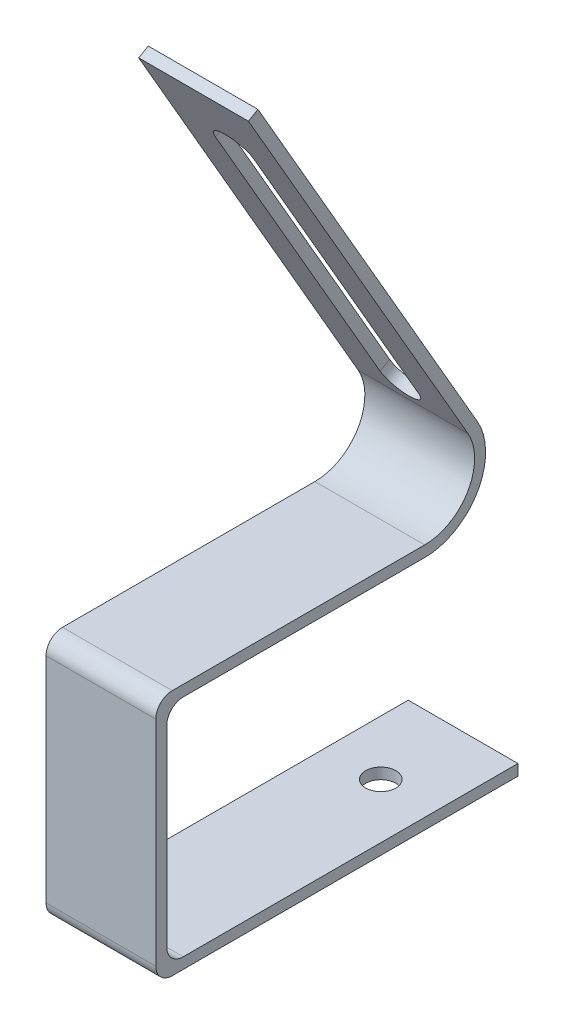
ISO-10303-21;
HEADER;
FILE_DESCRIPTION(('STEP AP214'),'2;1');
FILE_NAME('part.step','',(''),(''),'','','');
FILE_SCHEMA(('AUTOMOTIVE_DESIGN { 1 0 10303 214 1 1 1 1 }'));
ENDSEC;
DATA;
#1=APPLICATION_CONTEXT('core data for automotive mechanical design processes');
#2=APPLICATION_PROTOCOL_DEFINITION('international standard','automotive_design',2000,#1);
#3=PRODUCT_CONTEXT('',#1,'mechanical');
#4=PRODUCT('Part','Part','',(#3));
#5=PRODUCT_RELATED_PRODUCT_CATEGORY('part','',(#4));
#6=PRODUCT_DEFINITION_FORMATION('','',#4);
#7=PRODUCT_DEFINITION_CONTEXT('part definition',#1,'design');
#8=PRODUCT_DEFINITION('design','',#6,#7);
#9=PRODUCT_DEFINITION_SHAPE('','',#8);
#10=(LENGTH_UNIT() NAMED_UNIT(*) SI_UNIT(.MILLI.,.METRE.));
#11=(NAMED_UNIT(*) PLANE_ANGLE_UNIT() SI_UNIT($,.RADIAN.));
#12=(NAMED_UNIT(*) SI_UNIT($,.STERADIAN.) SOLID_ANGLE_UNIT());
#13=UNCERTAINTY_MEASURE_WITH_UNIT(LENGTH_MEASURE(1.E-05),#10,'distance_accuracy_value','');
#14=(GEOMETRIC_REPRESENTATION_CONTEXT(3) GLOBAL_UNCERTAINTY_ASSIGNED_CONTEXT((#13)) GLOBAL_UNIT_ASSIGNED_CONTEXT((#10,
#11,#12)) REPRESENTATION_CONTEXT('',''));
#15=CARTESIAN_POINT('',(0.,0.,0.));
#16=DIRECTION('',(0.,0.,1.));
#17=DIRECTION('',(1.,0.,0.));
#18=AXIS2_PLACEMENT_3D('',#15,#16,#17);
#19=CARTESIAN_POINT('',(20.,0.,0.));
#20=DIRECTION('',(0.,0.,-1.));
#21=DIRECTION('',(-1.,0.,0.));
#22=AXIS2_PLACEMENT_3D('',#19,#20,#21);
#23=PLANE('',#22);
#24=DIRECTION('',(0.,-1.,0.));
#25=VECTOR('',#24,1.);
#26=CARTESIAN_POINT('',(0.,0.,0.));
#27=LINE('',#26,#25);
#28=CARTESIAN_POINT('',(0.,42.,0.));
#29=VERTEX_POINT('',#28);
#30=CARTESIAN_POINT('',(0.,3.,0.));
#31=VERTEX_POINT('',#30);
#32=EDGE_CURVE('E207',#29,#31,#27,.T.);
#33=ORIENTED_EDGE('',*,*,#32,.T.);
#34=DIRECTION('',(-1.,0.,0.));
#35=VECTOR('',#34,1.);
#36=CARTESIAN_POINT('',(20.,3.,0.));
#37=LINE('',#36,#35);
#38=CARTESIAN_POINT('',(20.,3.,0.));
#39=VERTEX_POINT('',#38);
#40=EDGE_CURVE('E297',#31,#39,#37,.F.);
#41=ORIENTED_EDGE('',*,*,#40,.T.);
#42=DIRECTION('',(0.,-1.,0.));
#43=VECTOR('',#42,1.);
#44=CARTESIAN_POINT('',(20.,0.,0.));
#45=LINE('',#44,#43);
#46=CARTESIAN_POINT('',(20.,42.,0.));
#47=VERTEX_POINT('',#46);
#48=EDGE_CURVE('E208',#47,#39,#45,.T.);
#49=ORIENTED_EDGE('',*,*,#48,.F.);
#50=DIRECTION('',(-1.,0.,0.));
#51=VECTOR('',#50,1.);
#52=CARTESIAN_POINT('',(20.,42.,0.));
#53=LINE('',#52,#51);
#54=EDGE_CURVE('E294',#47,#29,#53,.T.);
#55=ORIENTED_EDGE('',*,*,#54,.T.);
#56=EDGE_LOOP('',(#33,#41,#49,#55));
#57=FACE_BOUND('',#56,.T.);
#58=ADVANCED_FACE('F34',(#57),#23,.F.);
#59=CARTESIAN_POINT('',(20.,0.,0.));
#60=DIRECTION('',(0.,1.,0.));
#61=DIRECTION('',(0.,0.,1.));
#62=AXIS2_PLACEMENT_3D('',#59,#60,#61);
#63=PLANE('',#62);
#64=CARTESIAN_POINT('',(10.,0.,-51.));
#65=DIRECTION('',(0.,-1.,0.));
#66=DIRECTION('',(0.,0.,-1.));
#67=AXIS2_PLACEMENT_3D('',#64,#65,#66);
#68=CIRCLE('',#67,2.75);
#69=CARTESIAN_POINT('',(10.,0.,-53.75));
#70=VERTEX_POINT('',#69);
#71=EDGE_CURVE('E200',#70,#70,#68,.T.);
#72=ORIENTED_EDGE('',*,*,#71,.F.);
#73=EDGE_LOOP('',(#72));
#74=FACE_BOUND('',#73,.T.);
#75=DIRECTION('',(0.,0.,-1.));
#76=VECTOR('',#75,1.);
#77=CARTESIAN_POINT('',(20.,0.,0.));
#78=LINE('',#77,#76);
#79=CARTESIAN_POINT('',(20.,0.,-3.));
#80=VERTEX_POINT('',#79);
#81=CARTESIAN_POINT('',(20.,0.,-66.));
#82=VERTEX_POINT('',#81);
#83=EDGE_CURVE('E211',#80,#82,#78,.T.);
#84=ORIENTED_EDGE('',*,*,#83,.F.);
#85=DIRECTION('',(-1.,0.,0.));
#86=VECTOR('',#85,1.);
#87=CARTESIAN_POINT('',(20.,0.,-3.));
#88=LINE('',#87,#86);
#89=CARTESIAN_POINT('',(0.,0.,-3.));
#90=VERTEX_POINT('',#89);
#91=EDGE_CURVE('E287',#80,#90,#88,.T.);
#92=ORIENTED_EDGE('',*,*,#91,.T.);
#93=DIRECTION('',(0.,0.,-1.));
#94=VECTOR('',#93,1.);
#95=CARTESIAN_POINT('',(0.,0.,0.));
#96=LINE('',#95,#94);
#97=CARTESIAN_POINT('',(0.,0.,-66.));
#98=VERTEX_POINT('',#97);
#99=EDGE_CURVE('E240',#90,#98,#96,.T.);
#100=ORIENTED_EDGE('',*,*,#99,.T.);
#101=DIRECTION('',(-1.,0.,0.));
#102=VECTOR('',#101,1.);
#103=CARTESIAN_POINT('',(20.,0.,-66.));
#104=LINE('',#103,#102);
#105=EDGE_CURVE('E284',#82,#98,#104,.T.);
#106=ORIENTED_EDGE('',*,*,#105,.F.);
#107=EDGE_LOOP('',(#84,#92,#100,#106));
#108=FACE_BOUND('',#107,.T.);
#109=ADVANCED_FACE('F380',(#74,#108),#63,.F.);
#110=CARTESIAN_POINT('',(20.,0.,-66.));
#111=DIRECTION('',(0.,0.,1.));
#112=DIRECTION('',(1.,0.,0.));
#113=AXIS2_PLACEMENT_3D('',#110,#111,#112);
#114=PLANE('',#113);
#115=DIRECTION('',(0.,1.,0.));
#116=VECTOR('',#115,1.);
#117=CARTESIAN_POINT('',(0.,0.,-66.));
#118=LINE('',#117,#116);
#119=CARTESIAN_POINT('',(0.,2.,-66.));
#120=VERTEX_POINT('',#119);
#121=EDGE_CURVE('E242',#98,#120,#118,.T.);
#122=ORIENTED_EDGE('',*,*,#121,.T.);
#123=DIRECTION('',(-1.,0.,0.));
#124=VECTOR('',#123,1.);
#125=CARTESIAN_POINT('',(20.,2.,-66.));
#126=LINE('',#125,#124);
#127=CARTESIAN_POINT('',(20.,2.,-66.));
#128=VERTEX_POINT('',#127);
#129=EDGE_CURVE('E281',#128,#120,#126,.T.);
#130=ORIENTED_EDGE('',*,*,#129,.F.);
#131=DIRECTION('',(0.,1.,0.));
#132=VECTOR('',#131,1.);
#133=CARTESIAN_POINT('',(20.,0.,-66.));
#134=LINE('',#133,#132);
#135=EDGE_CURVE('E214',#82,#128,#134,.T.);
#136=ORIENTED_EDGE('',*,*,#135,.F.);
#137=ORIENTED_EDGE('',*,*,#105,.T.);
#138=EDGE_LOOP('',(#122,#130,#136,#137));
#139=FACE_BOUND('',#138,.T.);
#140=ADVANCED_FACE('F385',(#139),#114,.F.);
#141=CARTESIAN_POINT('',(20.,2.,-66.));
#142=DIRECTION('',(0.,-1.,0.));
#143=DIRECTION('',(0.,0.,-1.));
#144=AXIS2_PLACEMENT_3D('',#141,#142,#143);
#145=PLANE('',#144);
#146=CARTESIAN_POINT('',(10.,2.,-51.));
#147=DIRECTION('',(0.,-1.,0.));
#148=DIRECTION('',(0.,0.,-1.));
#149=AXIS2_PLACEMENT_3D('',#146,#147,#148);
#150=CIRCLE('',#149,2.75);
#151=CARTESIAN_POINT('',(10.,2.,-53.75));
#152=VERTEX_POINT('',#151);
#153=EDGE_CURVE('E204',#152,#152,#150,.F.);
#154=ORIENTED_EDGE('',*,*,#153,.F.);
#155=EDGE_LOOP('',(#154));
#156=FACE_BOUND('',#155,.T.);
#157=DIRECTION('',(0.,0.,1.));
#158=VECTOR('',#157,1.);
#159=CARTESIAN_POINT('',(0.,2.,-66.));
#160=LINE('',#159,#158);
#161=CARTESIAN_POINT('',(0.,2.,-5.));
#162=VERTEX_POINT('',#161);
#163=EDGE_CURVE('E244',#120,#162,#160,.T.);
#164=ORIENTED_EDGE('',*,*,#163,.T.);
#165=DIRECTION('',(-1.,0.,0.));
#166=VECTOR('',#165,1.);
#167=CARTESIAN_POINT('',(20.,2.,-5.));
#168=LINE('',#167,#166);
#169=CARTESIAN_POINT('',(20.,2.,-5.));
#170=VERTEX_POINT('',#169);
#171=EDGE_CURVE('E308',#162,#170,#168,.F.);
#172=ORIENTED_EDGE('',*,*,#171,.T.);
#173=DIRECTION('',(0.,0.,1.));
#174=VECTOR('',#173,1.);
#175=CARTESIAN_POINT('',(20.,2.,-66.));
#176=LINE('',#175,#174);
#177=EDGE_CURVE('E216',#128,#170,#176,.T.);
#178=ORIENTED_EDGE('',*,*,#177,.F.);
#179=ORIENTED_EDGE('',*,*,#129,.T.);
#180=EDGE_LOOP('',(#164,#172,#178,#179));
#181=FACE_BOUND('',#180,.T.);
#182=ADVANCED_FACE('F393',(#156,#181),#145,.F.);
#183=CARTESIAN_POINT('',(20.,2.,-2.));
#184=DIRECTION('',(0.,0.,1.));
#185=DIRECTION('',(0.,-1.,0.));
#186=AXIS2_PLACEMENT_3D('',#183,#184,#185);
#187=PLANE('',#186);
#188=DIRECTION('',(0.,1.,0.));
#189=VECTOR('',#188,1.);
#190=CARTESIAN_POINT('',(20.,2.,-2.));
#191=LINE('',#190,#189);
#192=CARTESIAN_POINT('',(20.,5.,-2.));
#193=VERTEX_POINT('',#192);
#194=CARTESIAN_POINT('',(20.,40.,-2.));
#195=VERTEX_POINT('',#194);
#196=EDGE_CURVE('E219',#193,#195,#191,.T.);
#197=ORIENTED_EDGE('',*,*,#196,.F.);
#198=DIRECTION('',(-1.,0.,0.));
#199=VECTOR('',#198,1.);
#200=CARTESIAN_POINT('',(0.,5.,-2.));
#201=LINE('',#200,#199);
#202=CARTESIAN_POINT('',(0.,5.,-2.));
#203=VERTEX_POINT('',#202);
#204=EDGE_CURVE('E305',#193,#203,#201,.T.);
#205=ORIENTED_EDGE('',*,*,#204,.T.);
#206=DIRECTION('',(0.,1.,0.));
#207=VECTOR('',#206,1.);
#208=CARTESIAN_POINT('',(0.,2.,-2.));
#209=LINE('',#208,#207);
#210=CARTESIAN_POINT('',(0.,40.,-2.));
#211=VERTEX_POINT('',#210);
#212=EDGE_CURVE('E247',#203,#211,#209,.T.);
#213=ORIENTED_EDGE('',*,*,#212,.T.);
#214=DIRECTION('',(-1.,0.,0.));
#215=VECTOR('',#214,1.);
#216=CARTESIAN_POINT('',(20.,40.,-2.));
#217=LINE('',#216,#215);
#218=EDGE_CURVE('E303',#211,#195,#217,.F.);
#219=ORIENTED_EDGE('',*,*,#218,.T.);
#220=EDGE_LOOP('',(#197,#205,#213,#219));
#221=FACE_BOUND('',#220,.T.);
#222=ADVANCED_FACE('F329',(#221),#187,.F.);
#223=CARTESIAN_POINT('',(20.,43.,-2.));
#224=DIRECTION('',(0.,1.,0.));
#225=DIRECTION('',(0.,0.,1.));
#226=AXIS2_PLACEMENT_3D('',#223,#224,#225);
#227=PLANE('',#226);
#228=DIRECTION('',(0.,0.,-1.));
#229=VECTOR('',#228,1.);
#230=CARTESIAN_POINT('',(20.,43.,-2.));
#231=LINE('',#230,#229);
#232=CARTESIAN_POINT('',(20.,43.,-5.));
#233=VERTEX_POINT('',#232);
#234=CARTESIAN_POINT('',(20.,43.,-49.));
#235=VERTEX_POINT('',#234);
#236=EDGE_CURVE('E222',#233,#235,#231,.T.);
#237=ORIENTED_EDGE('',*,*,#236,.F.);
#238=DIRECTION('',(-1.,0.,0.));
#239=VECTOR('',#238,1.);
#240=CARTESIAN_POINT('',(0.,43.,-5.));
#241=LINE('',#240,#239);
#242=CARTESIAN_POINT('',(0.,43.,-5.));
#243=VERTEX_POINT('',#242);
#244=EDGE_CURVE('E310',#233,#243,#241,.T.);
#245=ORIENTED_EDGE('',*,*,#244,.T.);
#246=DIRECTION('',(0.,0.,-1.));
#247=VECTOR('',#246,1.);
#248=CARTESIAN_POINT('',(0.,43.,-2.));
#249=LINE('',#248,#247);
#250=CARTESIAN_POINT('',(0.,43.,-49.));
#251=VERTEX_POINT('',#250);
#252=EDGE_CURVE('E250',#243,#251,#249,.T.);
#253=ORIENTED_EDGE('',*,*,#252,.T.);
#254=DIRECTION('',(-1.,0.,0.));
#255=VECTOR('',#254,1.);
#256=CARTESIAN_POINT('',(20.,43.,-49.));
#257=LINE('',#256,#255);
#258=EDGE_CURVE('E278',#235,#251,#257,.T.);
#259=ORIENTED_EDGE('',*,*,#258,.F.);
#260=EDGE_LOOP('',(#237,#245,#253,#259));
#261=FACE_BOUND('',#260,.T.);
#262=ADVANCED_FACE('F338',(#261),#227,.F.);
#263=CARTESIAN_POINT('',(20.,54.1014655851397,-49.));
#264=DIRECTION('',(-1.,0.,0.));
#265=DIRECTION('',(0.,0.,1.));
#266=AXIS2_PLACEMENT_3D('',#263,#264,#265);
#267=CYLINDRICAL_SURFACE('',#266,11.1014655851397);
#268=CARTESIAN_POINT('',(0.,54.1014655851397,-49.));
#269=DIRECTION('',(1.,0.,0.));
#270=DIRECTION('',(0.,0.,1.));
#271=AXIS2_PLACEMENT_3D('',#268,#269,#270);
#272=CIRCLE('',#271,11.1014655851397);
#273=CARTESIAN_POINT('',(0.,59.6521983777095,-58.6141512159696));
#274=VERTEX_POINT('',#273);
#275=EDGE_CURVE('E252',#251,#274,#272,.T.);
#276=ORIENTED_EDGE('',*,*,#275,.T.);
#277=DIRECTION('',(-1.,0.,0.));
#278=VECTOR('',#277,1.);
#279=CARTESIAN_POINT('',(20.,59.6521983777095,-58.6141512159696));
#280=LINE('',#279,#278);
#281=CARTESIAN_POINT('',(20.,59.6521983777095,-58.6141512159696));
#282=VERTEX_POINT('',#281);
#283=EDGE_CURVE('E275',#282,#274,#280,.T.);
#284=ORIENTED_EDGE('',*,*,#283,.F.);
#285=CARTESIAN_POINT('',(20.,54.1014655851397,-49.));
#286=DIRECTION('',(1.,0.,0.));
#287=DIRECTION('',(0.,0.,1.));
#288=AXIS2_PLACEMENT_3D('',#285,#286,#287);
#289=CIRCLE('',#288,11.1014655851397);
#290=EDGE_CURVE('E224',#235,#282,#289,.T.);
#291=ORIENTED_EDGE('',*,*,#290,.F.);
#292=ORIENTED_EDGE('',*,*,#258,.T.);
#293=EDGE_LOOP('',(#276,#284,#291,#292));
#294=FACE_BOUND('',#293,.T.);
#295=ADVANCED_FACE('F342',(#294),#267,.T.);
#296=CARTESIAN_POINT('',(20.,128.934230680465,-18.6141512159698));
#297=DIRECTION('',(0.,-0.499999999999998,0.86602540378444));
#298=DIRECTION('',(0.,-0.86602540378444,-0.499999999999998));
#299=AXIS2_PLACEMENT_3D('',#296,#297,#298);
#300=PLANE('',#299);
#301=DIRECTION('',(0.,-0.86602540378444,-0.499999999999998));
#302=VECTOR('',#301,1.);
#303=CARTESIAN_POINT('',(13.5,115.943849623698,-26.1141512159698));
#304=LINE('',#303,#302);
#305=CARTESIAN_POINT('',(13.5,115.943849623698,-26.1141512159697));
#306=VERTEX_POINT('',#305);
#307=CARTESIAN_POINT('',(13.5,63.9823253966318,-56.1141512159697));
#308=VERTEX_POINT('',#307);
#309=EDGE_CURVE('E182',#306,#308,#304,.T.);
#310=ORIENTED_EDGE('',*,*,#309,.F.);
#311=CARTESIAN_POINT('',(10.,115.943849623698,-26.1141512159698));
#312=DIRECTION('',(0.,0.499999999999998,-0.86602540378444));
#313=DIRECTION('',(0.,-0.86602540378444,-0.499999999999998));
#314=AXIS2_PLACEMENT_3D('',#311,#312,#313);
#315=CIRCLE('',#314,3.5);
#316=CARTESIAN_POINT('',(6.5,115.943849623698,-26.1141512159698));
#317=VERTEX_POINT('',#316);
#318=EDGE_CURVE('E49',#317,#306,#315,.T.);
#319=ORIENTED_EDGE('',*,*,#318,.F.);
#320=DIRECTION('',(0.,0.86602540378444,0.499999999999998));
#321=VECTOR('',#320,1.);
#322=CARTESIAN_POINT('',(6.5,115.943849623698,-26.1141512159698));
#323=LINE('',#322,#321);
#324=CARTESIAN_POINT('',(6.49999999999999,63.9823253966318,-56.1141512159697));
#325=VERTEX_POINT('',#324);
#326=EDGE_CURVE('E189',#325,#317,#323,.T.);
#327=ORIENTED_EDGE('',*,*,#326,.F.);
#328=CARTESIAN_POINT('',(10.,63.9823253966318,-56.1141512159697));
#329=DIRECTION('',(0.,0.499999999999998,-0.86602540378444));
#330=DIRECTION('',(0.,0.86602540378444,0.499999999999998));
#331=AXIS2_PLACEMENT_3D('',#328,#329,#330);
#332=CIRCLE('',#331,3.5);
#333=EDGE_CURVE('E173',#308,#325,#332,.T.);
#334=ORIENTED_EDGE('',*,*,#333,.F.);
#335=EDGE_LOOP('',(#310,#319,#327,#334));
#336=FACE_BOUND('',#335,.T.);
#337=DIRECTION('',(0.,0.86602540378444,0.499999999999998));
#338=VECTOR('',#337,1.);
#339=CARTESIAN_POINT('',(0.,128.934230680465,-18.6141512159698));
#340=LINE('',#339,#338);
#341=CARTESIAN_POINT('',(0.,128.934230680465,-18.6141512159698));
#342=VERTEX_POINT('',#341);
#343=EDGE_CURVE('E254',#274,#342,#340,.T.);
#344=ORIENTED_EDGE('',*,*,#343,.T.);
#345=DIRECTION('',(-1.,0.,0.));
#346=VECTOR('',#345,1.);
#347=CARTESIAN_POINT('',(20.,128.934230680465,-18.6141512159698));
#348=LINE('',#347,#346);
#349=CARTESIAN_POINT('',(20.,128.934230680465,-18.6141512159698));
#350=VERTEX_POINT('',#349);
#351=EDGE_CURVE('E272',#350,#342,#348,.T.);
#352=ORIENTED_EDGE('',*,*,#351,.F.);
#353=DIRECTION('',(0.,0.86602540378444,0.499999999999998));
#354=VECTOR('',#353,1.);
#355=CARTESIAN_POINT('',(20.,128.934230680465,-18.6141512159698));
#356=LINE('',#355,#354);
#357=EDGE_CURVE('E226',#282,#350,#356,.T.);
#358=ORIENTED_EDGE('',*,*,#357,.F.);
#359=ORIENTED_EDGE('',*,*,#283,.T.);
#360=EDGE_LOOP('',(#344,#352,#358,#359));
#361=FACE_BOUND('',#360,.T.);
#362=ADVANCED_FACE('F186',(#336,#361),#300,.F.);
#363=CARTESIAN_POINT('',(20.,127.934230680465,-16.8821004084009));
#364=DIRECTION('',(0.,-0.866025403784431,-0.500000000000013));
#365=DIRECTION('',(0.,0.500000000000013,-0.866025403784431));
#366=AXIS2_PLACEMENT_3D('',#363,#364,#365);
#367=PLANE('',#366);
#368=DIRECTION('',(0.,-0.500000000000013,0.866025403784431));
#369=VECTOR('',#368,1.);
#370=CARTESIAN_POINT('',(0.,127.934230680465,-16.8821004084009));
#371=LINE('',#370,#369);
#372=CARTESIAN_POINT('',(0.,127.934230680465,-16.8821004084009));
#373=VERTEX_POINT('',#372);
#374=EDGE_CURVE('E256',#342,#373,#371,.T.);
#375=ORIENTED_EDGE('',*,*,#374,.T.);
#376=DIRECTION('',(-1.,0.,0.));
#377=VECTOR('',#376,1.);
#378=CARTESIAN_POINT('',(20.,127.934230680465,-16.8821004084009));
#379=LINE('',#378,#377);
#380=CARTESIAN_POINT('',(20.,127.934230680465,-16.8821004084009));
#381=VERTEX_POINT('',#380);
#382=EDGE_CURVE('E269',#381,#373,#379,.T.);
#383=ORIENTED_EDGE('',*,*,#382,.F.);
#384=DIRECTION('',(0.,-0.500000000000013,0.866025403784431));
#385=VECTOR('',#384,1.);
#386=CARTESIAN_POINT('',(20.,127.934230680465,-16.8821004084009));
#387=LINE('',#386,#385);
#388=EDGE_CURVE('E228',#350,#381,#387,.T.);
#389=ORIENTED_EDGE('',*,*,#388,.F.);
#390=ORIENTED_EDGE('',*,*,#351,.T.);
#391=EDGE_LOOP('',(#375,#383,#389,#390));
#392=FACE_BOUND('',#391,.T.);
#393=ADVANCED_FACE('F350',(#392),#367,.F.);
#394=CARTESIAN_POINT('',(20.,127.934230680465,-16.8821004084009));
#395=DIRECTION('',(0.,0.499999999999998,-0.86602540378444));
#396=DIRECTION('',(0.,0.86602540378444,0.499999999999998));
#397=AXIS2_PLACEMENT_3D('',#394,#395,#396);
#398=PLANE('',#397);
#399=DIRECTION('',(0.,-0.86602540378444,-0.499999999999998));
#400=VECTOR('',#399,1.);
#401=CARTESIAN_POINT('',(6.5,114.943849623698,-24.3821004084009));
#402=LINE('',#401,#400);
#403=CARTESIAN_POINT('',(6.5,114.943849623698,-24.3821004084009));
#404=VERTEX_POINT('',#403);
#405=CARTESIAN_POINT('',(6.49999999999999,62.9823253966318,-54.3821004084007));
#406=VERTEX_POINT('',#405);
#407=EDGE_CURVE('E558',#404,#406,#402,.T.);
#408=ORIENTED_EDGE('',*,*,#407,.F.);
#409=CARTESIAN_POINT('',(10.,114.943849623698,-24.3821004084009));
#410=DIRECTION('',(0.,0.499999999999998,-0.86602540378444));
#411=DIRECTION('',(0.,0.86602540378444,0.499999999999998));
#412=AXIS2_PLACEMENT_3D('',#409,#410,#411);
#413=CIRCLE('',#412,3.5);
#414=CARTESIAN_POINT('',(13.5,114.943849623698,-24.3821004084009));
#415=VERTEX_POINT('',#414);
#416=EDGE_CURVE('E201',#415,#404,#413,.F.);
#417=ORIENTED_EDGE('',*,*,#416,.F.);
#418=DIRECTION('',(0.,0.86602540378444,0.499999999999998));
#419=VECTOR('',#418,1.);
#420=CARTESIAN_POINT('',(13.5,114.943849623698,-24.3821004084009));
#421=LINE('',#420,#419);
#422=CARTESIAN_POINT('',(13.5,62.9823253966318,-54.3821004084007));
#423=VERTEX_POINT('',#422);
#424=EDGE_CURVE('E198',#423,#415,#421,.T.);
#425=ORIENTED_EDGE('',*,*,#424,.F.);
#426=CARTESIAN_POINT('',(10.,62.9823253966318,-54.3821004084007));
#427=DIRECTION('',(0.,0.499999999999998,-0.86602540378444));
#428=DIRECTION('',(0.,0.86602540378444,0.499999999999998));
#429=AXIS2_PLACEMENT_3D('',#426,#427,#428);
#430=CIRCLE('',#429,3.5);
#431=EDGE_CURVE('E176',#406,#423,#430,.F.);
#432=ORIENTED_EDGE('',*,*,#431,.F.);
#433=EDGE_LOOP('',(#408,#417,#425,#432));
#434=FACE_BOUND('',#433,.T.);
#435=DIRECTION('',(0.,-0.86602540378444,-0.499999999999998));
#436=VECTOR('',#435,1.);
#437=CARTESIAN_POINT('',(0.,127.934230680465,-16.8821004084009));
#438=LINE('',#437,#436);
#439=CARTESIAN_POINT('',(0.,58.6521983777095,-56.8821004084008));
#440=VERTEX_POINT('',#439);
#441=EDGE_CURVE('E258',#373,#440,#438,.T.);
#442=ORIENTED_EDGE('',*,*,#441,.T.);
#443=DIRECTION('',(-1.,0.,0.));
#444=VECTOR('',#443,1.);
#445=CARTESIAN_POINT('',(20.,58.6521983777095,-56.8821004084008));
#446=LINE('',#445,#444);
#447=CARTESIAN_POINT('',(20.,58.6521983777095,-56.8821004084008));
#448=VERTEX_POINT('',#447);
#449=EDGE_CURVE('E266',#448,#440,#446,.T.);
#450=ORIENTED_EDGE('',*,*,#449,.F.);
#451=DIRECTION('',(0.,-0.86602540378444,-0.499999999999998));
#452=VECTOR('',#451,1.);
#453=CARTESIAN_POINT('',(20.,127.934230680465,-16.8821004084009));
#454=LINE('',#453,#452);
#455=EDGE_CURVE('E230',#381,#448,#454,.T.);
#456=ORIENTED_EDGE('',*,*,#455,.F.);
#457=ORIENTED_EDGE('',*,*,#382,.T.);
#458=EDGE_LOOP('',(#442,#450,#456,#457));
#459=FACE_BOUND('',#458,.T.);
#460=ADVANCED_FACE('F355',(#434,#459),#398,.F.);
#461=CARTESIAN_POINT('',(20.,54.1014655851397,-49.));
#462=DIRECTION('',(-1.,0.,0.));
#463=DIRECTION('',(0.,0.,1.));
#464=AXIS2_PLACEMENT_3D('',#461,#462,#463);
#465=CYLINDRICAL_SURFACE('',#464,9.10146558513965);
#466=CARTESIAN_POINT('',(0.,54.1014655851397,-49.));
#467=DIRECTION('',(-1.,0.,0.));
#468=DIRECTION('',(0.,0.,1.));
#469=AXIS2_PLACEMENT_3D('',#466,#467,#468);
#470=CIRCLE('',#469,9.10146558513965);
#471=CARTESIAN_POINT('',(0.,45.,-49.));
#472=VERTEX_POINT('',#471);
#473=EDGE_CURVE('E260',#440,#472,#470,.T.);
#474=ORIENTED_EDGE('',*,*,#473,.T.);
#475=DIRECTION('',(-1.,0.,0.));
#476=VECTOR('',#475,1.);
#477=CARTESIAN_POINT('',(20.,45.,-49.));
#478=LINE('',#477,#476);
#479=CARTESIAN_POINT('',(20.,45.,-49.));
#480=VERTEX_POINT('',#479);
#481=EDGE_CURVE('E237',#480,#472,#478,.T.);
#482=ORIENTED_EDGE('',*,*,#481,.F.);
#483=CARTESIAN_POINT('',(20.,54.1014655851397,-49.));
#484=DIRECTION('',(-1.,0.,0.));
#485=DIRECTION('',(0.,0.,1.));
#486=AXIS2_PLACEMENT_3D('',#483,#484,#485);
#487=CIRCLE('',#486,9.10146558513965);
#488=EDGE_CURVE('E232',#448,#480,#487,.T.);
#489=ORIENTED_EDGE('',*,*,#488,.F.);
#490=ORIENTED_EDGE('',*,*,#449,.T.);
#491=EDGE_LOOP('',(#474,#482,#489,#490));
#492=FACE_BOUND('',#491,.T.);
#493=ADVANCED_FACE('F361',(#492),#465,.F.);
#494=CARTESIAN_POINT('',(20.,45.,0.));
#495=DIRECTION('',(0.,-1.,0.));
#496=DIRECTION('',(0.,0.,-1.));
#497=AXIS2_PLACEMENT_3D('',#494,#495,#496);
#498=PLANE('',#497);
#499=DIRECTION('',(0.,0.,1.));
#500=VECTOR('',#499,1.);
#501=CARTESIAN_POINT('',(0.,45.,0.));
#502=LINE('',#501,#500);
#503=CARTESIAN_POINT('',(0.,45.,-3.));
#504=VERTEX_POINT('',#503);
#505=EDGE_CURVE('E212',#472,#504,#502,.T.);
#506=ORIENTED_EDGE('',*,*,#505,.T.);
#507=DIRECTION('',(-1.,0.,0.));
#508=VECTOR('',#507,1.);
#509=CARTESIAN_POINT('',(20.,45.,-3.));
#510=LINE('',#509,#508);
#511=CARTESIAN_POINT('',(20.,45.,-3.));
#512=VERTEX_POINT('',#511);
#513=EDGE_CURVE('E313',#504,#512,#510,.F.);
#514=ORIENTED_EDGE('',*,*,#513,.T.);
#515=DIRECTION('',(0.,0.,1.));
#516=VECTOR('',#515,1.);
#517=CARTESIAN_POINT('',(20.,45.,0.));
#518=LINE('',#517,#516);
#519=EDGE_CURVE('E234',#480,#512,#518,.T.);
#520=ORIENTED_EDGE('',*,*,#519,.F.);
#521=ORIENTED_EDGE('',*,*,#481,.T.);
#522=EDGE_LOOP('',(#506,#514,#520,#521));
#523=FACE_BOUND('',#522,.T.);
#524=ADVANCED_FACE('F365',(#523),#498,.F.);
#525=CARTESIAN_POINT('',(20.,54.1014655851397,-49.));
#526=DIRECTION('',(-1.,0.,0.));
#527=DIRECTION('',(0.,0.,1.));
#528=AXIS2_PLACEMENT_3D('',#525,#526,#527);
#529=PLANE('',#528);
#530=ORIENTED_EDGE('',*,*,#48,.T.);
#531=CARTESIAN_POINT('',(20.,3.,-3.));
#532=DIRECTION('',(-1.,0.,0.));
#533=DIRECTION('',(0.,0.,1.));
#534=AXIS2_PLACEMENT_3D('',#531,#532,#533);
#535=CIRCLE('',#534,3.);
#536=EDGE_CURVE('E301',#39,#80,#535,.F.);
#537=ORIENTED_EDGE('',*,*,#536,.T.);
#538=ORIENTED_EDGE('',*,*,#83,.T.);
#539=ORIENTED_EDGE('',*,*,#135,.T.);
#540=ORIENTED_EDGE('',*,*,#177,.T.);
#541=CARTESIAN_POINT('',(20.,5.,-5.));
#542=DIRECTION('',(-1.,0.,0.));
#543=DIRECTION('',(0.,0.,1.));
#544=AXIS2_PLACEMENT_3D('',#541,#542,#543);
#545=CIRCLE('',#544,3.);
#546=EDGE_CURVE('E317',#170,#193,#545,.T.);
#547=ORIENTED_EDGE('',*,*,#546,.T.);
#548=ORIENTED_EDGE('',*,*,#196,.T.);
#549=CARTESIAN_POINT('',(20.,40.,-5.));
#550=DIRECTION('',(-1.,0.,0.));
#551=DIRECTION('',(0.,0.,1.));
#552=AXIS2_PLACEMENT_3D('',#549,#550,#551);
#553=CIRCLE('',#552,3.);
#554=EDGE_CURVE('E11',#195,#233,#553,.T.);
#555=ORIENTED_EDGE('',*,*,#554,.T.);
#556=ORIENTED_EDGE('',*,*,#236,.T.);
#557=ORIENTED_EDGE('',*,*,#290,.T.);
#558=ORIENTED_EDGE('',*,*,#357,.T.);
#559=ORIENTED_EDGE('',*,*,#388,.T.);
#560=ORIENTED_EDGE('',*,*,#455,.T.);
#561=ORIENTED_EDGE('',*,*,#488,.T.);
#562=ORIENTED_EDGE('',*,*,#519,.T.);
#563=CARTESIAN_POINT('',(20.,42.,-3.));
#564=DIRECTION('',(-1.,0.,0.));
#565=DIRECTION('',(0.,0.,1.));
#566=AXIS2_PLACEMENT_3D('',#563,#564,#565);
#567=CIRCLE('',#566,3.);
#568=EDGE_CURVE('E299',#512,#47,#567,.F.);
#569=ORIENTED_EDGE('',*,*,#568,.T.);
#570=EDGE_LOOP('',(#530,#537,#538,#539,#540,#547,#548,#555,#556,#557,#558,#559,#560,#561,#562,#569));
#571=FACE_BOUND('',#570,.T.);
#572=ADVANCED_FACE('F335',(#571),#529,.F.);
#573=CARTESIAN_POINT('',(0.,54.1014655851397,-49.));
#574=DIRECTION('',(-1.,0.,0.));
#575=DIRECTION('',(0.,0.,1.));
#576=AXIS2_PLACEMENT_3D('',#573,#574,#575);
#577=PLANE('',#576);
#578=ORIENTED_EDGE('',*,*,#99,.F.);
#579=CARTESIAN_POINT('',(0.,3.,-3.));
#580=DIRECTION('',(-1.,0.,0.));
#581=DIRECTION('',(0.,0.,1.));
#582=AXIS2_PLACEMENT_3D('',#579,#580,#581);
#583=CIRCLE('',#582,3.);
#584=EDGE_CURVE('E292',#90,#31,#583,.T.);
#585=ORIENTED_EDGE('',*,*,#584,.T.);
#586=ORIENTED_EDGE('',*,*,#32,.F.);
#587=CARTESIAN_POINT('',(0.,42.,-3.));
#588=DIRECTION('',(-1.,0.,0.));
#589=DIRECTION('',(0.,0.,1.));
#590=AXIS2_PLACEMENT_3D('',#587,#588,#589);
#591=CIRCLE('',#590,3.);
#592=EDGE_CURVE('E290',#29,#504,#591,.T.);
#593=ORIENTED_EDGE('',*,*,#592,.T.);
#594=ORIENTED_EDGE('',*,*,#505,.F.);
#595=ORIENTED_EDGE('',*,*,#473,.F.);
#596=ORIENTED_EDGE('',*,*,#441,.F.);
#597=ORIENTED_EDGE('',*,*,#374,.F.);
#598=ORIENTED_EDGE('',*,*,#343,.F.);
#599=ORIENTED_EDGE('',*,*,#275,.F.);
#600=ORIENTED_EDGE('',*,*,#252,.F.);
#601=CARTESIAN_POINT('',(0.,40.,-5.));
#602=DIRECTION('',(-1.,0.,0.));
#603=DIRECTION('',(0.,0.,1.));
#604=AXIS2_PLACEMENT_3D('',#601,#602,#603);
#605=CIRCLE('',#604,3.);
#606=EDGE_CURVE('E42',#243,#211,#605,.F.);
#607=ORIENTED_EDGE('',*,*,#606,.T.);
#608=ORIENTED_EDGE('',*,*,#212,.F.);
#609=CARTESIAN_POINT('',(0.,5.,-5.));
#610=DIRECTION('',(-1.,0.,0.));
#611=DIRECTION('',(0.,0.,1.));
#612=AXIS2_PLACEMENT_3D('',#609,#610,#611);
#613=CIRCLE('',#612,3.);
#614=EDGE_CURVE('E315',#203,#162,#613,.F.);
#615=ORIENTED_EDGE('',*,*,#614,.T.);
#616=ORIENTED_EDGE('',*,*,#163,.F.);
#617=ORIENTED_EDGE('',*,*,#121,.F.);
#618=EDGE_LOOP('',(#578,#585,#586,#593,#594,#595,#596,#597,#598,#599,#600,#607,#608,#615,#616,#617));
#619=FACE_BOUND('',#618,.T.);
#620=ADVANCED_FACE('F322',(#619),#577,.T.);
#621=CARTESIAN_POINT('',(20.,3.,-3.));
#622=DIRECTION('',(-1.,0.,0.));
#623=DIRECTION('',(0.,0.,1.));
#624=AXIS2_PLACEMENT_3D('',#621,#622,#623);
#625=CYLINDRICAL_SURFACE('',#624,3.);
#626=ORIENTED_EDGE('',*,*,#536,.F.);
#627=ORIENTED_EDGE('',*,*,#40,.F.);
#628=ORIENTED_EDGE('',*,*,#584,.F.);
#629=ORIENTED_EDGE('',*,*,#91,.F.);
#630=EDGE_LOOP('',(#626,#627,#628,#629));
#631=FACE_BOUND('',#630,.T.);
#632=ADVANCED_FACE('F375',(#631),#625,.T.);
#633=CARTESIAN_POINT('',(20.,5.,-5.));
#634=DIRECTION('',(1.,0.,0.));
#635=DIRECTION('',(0.,0.,-1.));
#636=AXIS2_PLACEMENT_3D('',#633,#634,#635);
#637=CYLINDRICAL_SURFACE('',#636,3.);
#638=ORIENTED_EDGE('',*,*,#546,.F.);
#639=ORIENTED_EDGE('',*,*,#171,.F.);
#640=ORIENTED_EDGE('',*,*,#614,.F.);
#641=ORIENTED_EDGE('',*,*,#204,.F.);
#642=EDGE_LOOP('',(#638,#639,#640,#641));
#643=FACE_BOUND('',#642,.T.);
#644=ADVANCED_FACE('F391',(#643),#637,.F.);
#645=CARTESIAN_POINT('',(20.,40.,-5.));
#646=DIRECTION('',(1.,0.,0.));
#647=DIRECTION('',(0.,0.,-1.));
#648=AXIS2_PLACEMENT_3D('',#645,#646,#647);
#649=CYLINDRICAL_SURFACE('',#648,3.);
#650=ORIENTED_EDGE('',*,*,#554,.F.);
#651=ORIENTED_EDGE('',*,*,#218,.F.);
#652=ORIENTED_EDGE('',*,*,#606,.F.);
#653=ORIENTED_EDGE('',*,*,#244,.F.);
#654=EDGE_LOOP('',(#650,#651,#652,#653));
#655=FACE_BOUND('',#654,.T.);
#656=ADVANCED_FACE('F332',(#655),#649,.F.);
#657=CARTESIAN_POINT('',(20.,42.,-3.));
#658=DIRECTION('',(-1.,0.,0.));
#659=DIRECTION('',(0.,0.,1.));
#660=AXIS2_PLACEMENT_3D('',#657,#658,#659);
#661=CYLINDRICAL_SURFACE('',#660,3.);
#662=ORIENTED_EDGE('',*,*,#568,.F.);
#663=ORIENTED_EDGE('',*,*,#513,.F.);
#664=ORIENTED_EDGE('',*,*,#592,.F.);
#665=ORIENTED_EDGE('',*,*,#54,.F.);
#666=EDGE_LOOP('',(#662,#663,#664,#665));
#667=FACE_BOUND('',#666,.T.);
#668=ADVANCED_FACE('F36',(#667),#661,.T.);
#669=CARTESIAN_POINT('',(10.,9.77817459305203,-51.));
#670=DIRECTION('',(0.,-1.,0.));
#671=DIRECTION('',(0.,0.,-1.));
#672=AXIS2_PLACEMENT_3D('',#669,#670,#671);
#673=CYLINDRICAL_SURFACE('',#672,2.75);
#674=ORIENTED_EDGE('',*,*,#153,.T.);
#675=EDGE_LOOP('',(#674));
#676=FACE_BOUND('',#675,.T.);
#677=ORIENTED_EDGE('',*,*,#71,.T.);
#678=EDGE_LOOP('',(#677));
#679=FACE_BOUND('',#678,.T.);
#680=ADVANCED_FACE('F419',(#676,#679),#673,.F.);
#681=CARTESIAN_POINT('',(10.,81.2615100374997,33.9574230726837));
#682=DIRECTION('',(0.,0.499999999999998,-0.86602540378444));
#683=DIRECTION('',(0.,0.86602540378444,0.499999999999998));
#684=AXIS2_PLACEMENT_3D('',#681,#682,#683);
#685=CYLINDRICAL_SURFACE('',#684,3.5);
#686=ORIENTED_EDGE('',*,*,#416,.T.);
#687=DIRECTION('',(0.,0.499999999999998,-0.86602540378444));
#688=VECTOR('',#687,1.);
#689=CARTESIAN_POINT('',(6.5,81.2615100374997,33.9574230726837));
#690=LINE('',#689,#688);
#691=EDGE_CURVE('E194',#404,#317,#690,.T.);
#692=ORIENTED_EDGE('',*,*,#691,.T.);
#693=ORIENTED_EDGE('',*,*,#318,.T.);
#694=DIRECTION('',(0.,0.499999999999998,-0.86602540378444));
#695=VECTOR('',#694,1.);
#696=CARTESIAN_POINT('',(13.5,81.2615100374997,33.9574230726837));
#697=LINE('',#696,#695);
#698=EDGE_CURVE('E179',#415,#306,#697,.T.);
#699=ORIENTED_EDGE('',*,*,#698,.F.);
#700=EDGE_LOOP('',(#686,#692,#693,#699));
#701=FACE_BOUND('',#700,.T.);
#702=ADVANCED_FACE('F423',(#701),#685,.F.);
#703=CARTESIAN_POINT('',(6.5,81.2615100374997,33.9574230726837));
#704=DIRECTION('',(-1.,0.,0.));
#705=DIRECTION('',(0.,-1.,0.));
#706=AXIS2_PLACEMENT_3D('',#703,#704,#705);
#707=PLANE('',#706);
#708=ORIENTED_EDGE('',*,*,#407,.T.);
#709=DIRECTION('',(0.,0.499999999999998,-0.86602540378444));
#710=VECTOR('',#709,1.);
#711=CARTESIAN_POINT('',(6.49999999999999,29.2999858104333,3.95742307268376));
#712=LINE('',#711,#710);
#713=EDGE_CURVE('E178',#406,#325,#712,.T.);
#714=ORIENTED_EDGE('',*,*,#713,.T.);
#715=ORIENTED_EDGE('',*,*,#326,.T.);
#716=ORIENTED_EDGE('',*,*,#691,.F.);
#717=EDGE_LOOP('',(#708,#714,#715,#716));
#718=FACE_BOUND('',#717,.T.);
#719=ADVANCED_FACE('F429',(#718),#707,.F.);
#720=CARTESIAN_POINT('',(10.,29.2999858104333,3.95742307268376));
#721=DIRECTION('',(0.,0.499999999999998,-0.86602540378444));
#722=DIRECTION('',(0.,0.86602540378444,0.499999999999998));
#723=AXIS2_PLACEMENT_3D('',#720,#721,#722);
#724=CYLINDRICAL_SURFACE('',#723,3.5);
#725=ORIENTED_EDGE('',*,*,#431,.T.);
#726=DIRECTION('',(0.,0.499999999999998,-0.86602540378444));
#727=VECTOR('',#726,1.);
#728=CARTESIAN_POINT('',(13.5,29.2999858104333,3.95742307268376));
#729=LINE('',#728,#727);
#730=EDGE_CURVE('E57',#423,#308,#729,.T.);
#731=ORIENTED_EDGE('',*,*,#730,.T.);
#732=ORIENTED_EDGE('',*,*,#333,.T.);
#733=ORIENTED_EDGE('',*,*,#713,.F.);
#734=EDGE_LOOP('',(#725,#731,#732,#733));
#735=FACE_BOUND('',#734,.T.);
#736=ADVANCED_FACE('F170',(#735),#724,.F.);
#737=CARTESIAN_POINT('',(13.5,81.2615100374997,33.9574230726837));
#738=DIRECTION('',(1.,0.,0.));
#739=DIRECTION('',(0.,1.,0.));
#740=AXIS2_PLACEMENT_3D('',#737,#738,#739);
#741=PLANE('',#740);
#742=ORIENTED_EDGE('',*,*,#424,.T.);
#743=ORIENTED_EDGE('',*,*,#698,.T.);
#744=ORIENTED_EDGE('',*,*,#309,.T.);
#745=ORIENTED_EDGE('',*,*,#730,.F.);
#746=EDGE_LOOP('',(#742,#743,#744,#745));
#747=FACE_BOUND('',#746,.T.);
#748=ADVANCED_FACE('F183',(#747),#741,.F.);
#749=CLOSED_SHELL('',(#58,#109,#140,#182,#222,#262,#295,#362,#393,#460,#493,#524,#572,#620,#632,
#644,#656,#668,#680,#702,#719,#736,#748));
#750=MANIFOLD_SOLID_BREP('B2',#749);
#751=ADVANCED_BREP_SHAPE_REPRESENTATION('',(#18,#750),#14);
#752=SHAPE_DEFINITION_REPRESENTATION(#9,#751);
ENDSEC;
END-ISO-10303-21;
